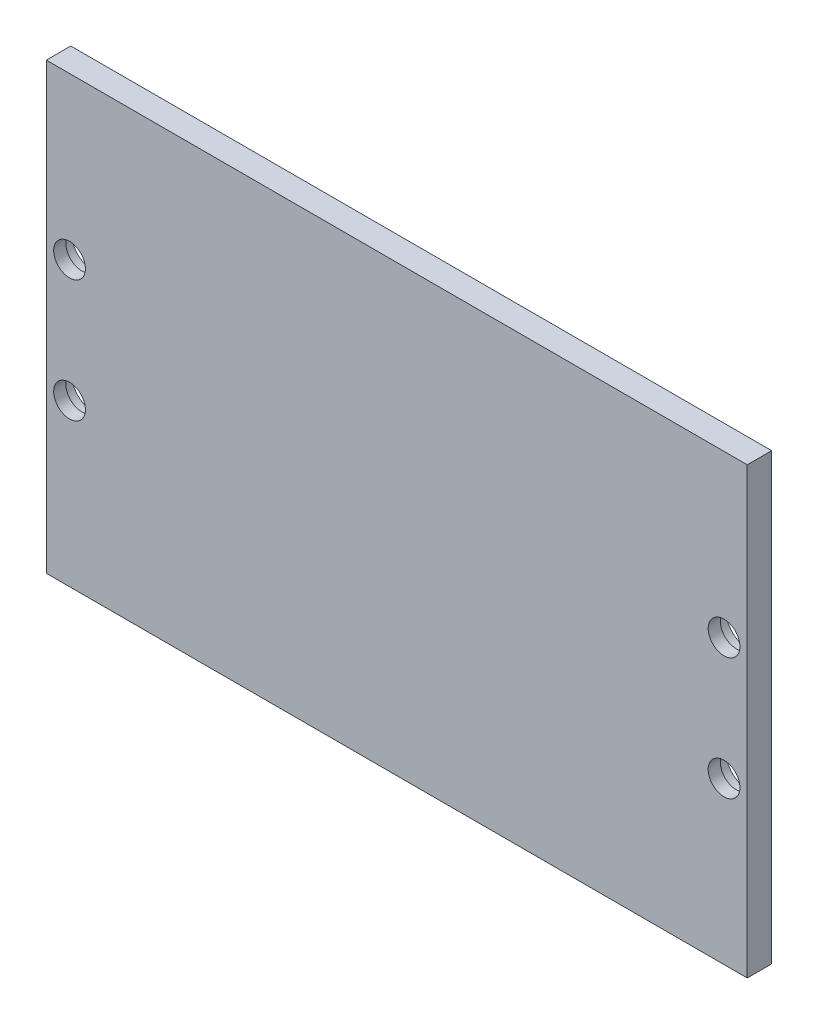
ISO-10303-21;
HEADER;
FILE_DESCRIPTION(('STEP AP214'),'2;1');
FILE_NAME('part.step','',(''),(''),'','','');
FILE_SCHEMA(('AUTOMOTIVE_DESIGN { 1 0 10303 214 1 1 1 1 }'));
ENDSEC;
DATA;
#1=APPLICATION_CONTEXT('core data for automotive mechanical design processes');
#2=APPLICATION_PROTOCOL_DEFINITION('international standard','automotive_design',2000,#1);
#3=PRODUCT_CONTEXT('',#1,'mechanical');
#4=PRODUCT('Part','Part','',(#3));
#5=PRODUCT_RELATED_PRODUCT_CATEGORY('part','',(#4));
#6=PRODUCT_DEFINITION_FORMATION('','',#4);
#7=PRODUCT_DEFINITION_CONTEXT('part definition',#1,'design');
#8=PRODUCT_DEFINITION('design','',#6,#7);
#9=PRODUCT_DEFINITION_SHAPE('','',#8);
#10=(LENGTH_UNIT() NAMED_UNIT(*) SI_UNIT(.MILLI.,.METRE.));
#11=(NAMED_UNIT(*) PLANE_ANGLE_UNIT() SI_UNIT($,.RADIAN.));
#12=(NAMED_UNIT(*) SI_UNIT($,.STERADIAN.) SOLID_ANGLE_UNIT());
#13=UNCERTAINTY_MEASURE_WITH_UNIT(LENGTH_MEASURE(1.E-05),#10,'distance_accuracy_value','');
#14=(GEOMETRIC_REPRESENTATION_CONTEXT(3) GLOBAL_UNCERTAINTY_ASSIGNED_CONTEXT((#13)) GLOBAL_UNIT_ASSIGNED_CONTEXT((#10,
#11,#12)) REPRESENTATION_CONTEXT('',''));
#15=CARTESIAN_POINT('',(0.,0.,0.));
#16=DIRECTION('',(0.,0.,1.));
#17=DIRECTION('',(1.,0.,0.));
#18=AXIS2_PLACEMENT_3D('',#15,#16,#17);
#19=CARTESIAN_POINT('',(25.5706075886704,34.3773615630913,0.));
#20=DIRECTION('',(0.,0.,1.));
#21=DIRECTION('',(1.,0.,0.));
#22=AXIS2_PLACEMENT_3D('',#19,#20,#21);
#23=CYLINDRICAL_SURFACE('',#22,0.925);
#24=CARTESIAN_POINT('',(25.5706075886704,34.3773615630913,0.));
#25=DIRECTION('',(0.,0.,1.));
#26=DIRECTION('',(1.,0.,0.));
#27=AXIS2_PLACEMENT_3D('',#24,#25,#26);
#28=CIRCLE('',#27,0.925);
#29=CARTESIAN_POINT('',(26.4956075886704,34.3773615630913,0.));
#30=VERTEX_POINT('',#29);
#31=EDGE_CURVE('E105',#30,#30,#28,.T.);
#32=ORIENTED_EDGE('',*,*,#31,.F.);
#33=EDGE_LOOP('',(#32));
#34=FACE_BOUND('',#33,.T.);
#35=CARTESIAN_POINT('',(25.5706075886704,34.3773615630913,0.500000000000003));
#36=DIRECTION('',(0.,0.,1.));
#37=DIRECTION('',(0.,-1.,0.));
#38=AXIS2_PLACEMENT_3D('',#35,#36,#37);
#39=CIRCLE('',#38,0.925);
#40=CARTESIAN_POINT('',(25.5706075886704,33.4523615630913,0.500000000000004));
#41=VERTEX_POINT('',#40);
#42=EDGE_CURVE('E11',#41,#41,#39,.F.);
#43=ORIENTED_EDGE('',*,*,#42,.F.);
#44=EDGE_LOOP('',(#43));
#45=FACE_BOUND('',#44,.T.);
#46=ADVANCED_FACE('F33',(#34,#45),#23,.F.);
#47=CARTESIAN_POINT('',(-1.22939241132963,29.3773615630913,0.));
#48=DIRECTION('',(0.,0.,1.));
#49=DIRECTION('',(1.,0.,0.));
#50=AXIS2_PLACEMENT_3D('',#47,#48,#49);
#51=CYLINDRICAL_SURFACE('',#50,0.924999999999999);
#52=CARTESIAN_POINT('',(-1.22939241132963,29.3773615630913,0.));
#53=DIRECTION('',(0.,0.,1.));
#54=DIRECTION('',(1.,0.,0.));
#55=AXIS2_PLACEMENT_3D('',#52,#53,#54);
#56=CIRCLE('',#55,0.924999999999999);
#57=CARTESIAN_POINT('',(-0.304392411329634,29.3773615630913,0.));
#58=VERTEX_POINT('',#57);
#59=EDGE_CURVE('E331',#58,#58,#56,.T.);
#60=ORIENTED_EDGE('',*,*,#59,.F.);
#61=EDGE_LOOP('',(#60));
#62=FACE_BOUND('',#61,.T.);
#63=CARTESIAN_POINT('',(-1.22939241132963,29.3773615630913,0.500000000000005));
#64=DIRECTION('',(0.,0.,1.));
#65=DIRECTION('',(0.,-1.,0.));
#66=AXIS2_PLACEMENT_3D('',#63,#64,#65);
#67=CIRCLE('',#66,0.924999999999999);
#68=CARTESIAN_POINT('',(-1.22939241132963,28.4523615630913,0.500000000000005));
#69=VERTEX_POINT('',#68);
#70=EDGE_CURVE('E42',#69,#69,#67,.F.);
#71=ORIENTED_EDGE('',*,*,#70,.F.);
#72=EDGE_LOOP('',(#71));
#73=FACE_BOUND('',#72,.T.);
#74=ADVANCED_FACE('F117',(#62,#73),#51,.F.);
#75=CARTESIAN_POINT('',(26.5206075886704,22.7773615630913,1.));
#76=DIRECTION('',(-1.,0.,0.));
#77=DIRECTION('',(0.,-1.,0.));
#78=AXIS2_PLACEMENT_3D('',#75,#76,#77);
#79=PLANE('',#78);
#80=DIRECTION('',(0.,1.,0.));
#81=VECTOR('',#80,1.);
#82=CARTESIAN_POINT('',(26.5206075886704,22.7773615630913,0.));
#83=LINE('',#82,#81);
#84=CARTESIAN_POINT('',(26.5206075886704,22.7773615630913,0.));
#85=VERTEX_POINT('',#84);
#86=CARTESIAN_POINT('',(26.5206075886704,40.9773615630913,0.));
#87=VERTEX_POINT('',#86);
#88=EDGE_CURVE('E102',#85,#87,#83,.T.);
#89=ORIENTED_EDGE('',*,*,#88,.T.);
#90=DIRECTION('',(0.,0.,-1.));
#91=VECTOR('',#90,1.);
#92=CARTESIAN_POINT('',(26.5206075886704,40.9773615630913,1.));
#93=LINE('',#92,#91);
#94=CARTESIAN_POINT('',(26.5206075886704,40.9773615630913,1.));
#95=VERTEX_POINT('',#94);
#96=EDGE_CURVE('E93',#95,#87,#93,.T.);
#97=ORIENTED_EDGE('',*,*,#96,.F.);
#98=DIRECTION('',(0.,1.,0.));
#99=VECTOR('',#98,1.);
#100=CARTESIAN_POINT('',(26.5206075886704,22.7773615630913,1.));
#101=LINE('',#100,#99);
#102=CARTESIAN_POINT('',(26.5206075886704,22.7773615630913,1.));
#103=VERTEX_POINT('',#102);
#104=EDGE_CURVE('E87',#103,#95,#101,.T.);
#105=ORIENTED_EDGE('',*,*,#104,.F.);
#106=DIRECTION('',(0.,0.,-1.));
#107=VECTOR('',#106,1.);
#108=CARTESIAN_POINT('',(26.5206075886704,22.7773615630913,1.));
#109=LINE('',#108,#107);
#110=EDGE_CURVE('E98',#103,#85,#109,.T.);
#111=ORIENTED_EDGE('',*,*,#110,.T.);
#112=EDGE_LOOP('',(#89,#97,#105,#111));
#113=FACE_BOUND('',#112,.T.);
#114=ADVANCED_FACE('F35',(#113),#79,.F.);
#115=CARTESIAN_POINT('',(26.5206075886704,40.9773615630913,1.));
#116=DIRECTION('',(0.,-1.,0.));
#117=DIRECTION('',(0.,0.,-1.));
#118=AXIS2_PLACEMENT_3D('',#115,#116,#117);
#119=PLANE('',#118);
#120=DIRECTION('',(-1.,0.,0.));
#121=VECTOR('',#120,1.);
#122=CARTESIAN_POINT('',(26.5206075886704,40.9773615630913,0.));
#123=LINE('',#122,#121);
#124=CARTESIAN_POINT('',(-2.17939241132963,40.9773615630913,0.));
#125=VERTEX_POINT('',#124);
#126=EDGE_CURVE('E92',#87,#125,#123,.T.);
#127=ORIENTED_EDGE('',*,*,#126,.T.);
#128=DIRECTION('',(0.,0.,-1.));
#129=VECTOR('',#128,1.);
#130=CARTESIAN_POINT('',(-2.17939241132963,40.9773615630913,1.));
#131=LINE('',#130,#129);
#132=CARTESIAN_POINT('',(-2.17939241132963,40.9773615630913,1.));
#133=VERTEX_POINT('',#132);
#134=EDGE_CURVE('E90',#133,#125,#131,.T.);
#135=ORIENTED_EDGE('',*,*,#134,.F.);
#136=DIRECTION('',(-1.,0.,0.));
#137=VECTOR('',#136,1.);
#138=CARTESIAN_POINT('',(26.5206075886704,40.9773615630913,1.));
#139=LINE('',#138,#137);
#140=EDGE_CURVE('E81',#95,#133,#139,.T.);
#141=ORIENTED_EDGE('',*,*,#140,.F.);
#142=ORIENTED_EDGE('',*,*,#96,.T.);
#143=EDGE_LOOP('',(#127,#135,#141,#142));
#144=FACE_BOUND('',#143,.T.);
#145=ADVANCED_FACE('F91',(#144),#119,.F.);
#146=CARTESIAN_POINT('',(-2.17939241132964,22.7773615630913,1.));
#147=DIRECTION('',(1.,0.,0.));
#148=DIRECTION('',(0.,1.,0.));
#149=AXIS2_PLACEMENT_3D('',#146,#147,#148);
#150=PLANE('',#149);
#151=DIRECTION('',(0.,-1.,0.));
#152=VECTOR('',#151,1.);
#153=CARTESIAN_POINT('',(-2.17939241132964,22.7773615630913,0.));
#154=LINE('',#153,#152);
#155=CARTESIAN_POINT('',(-2.17939241132964,22.7773615630913,0.));
#156=VERTEX_POINT('',#155);
#157=EDGE_CURVE('E67',#125,#156,#154,.T.);
#158=ORIENTED_EDGE('',*,*,#157,.T.);
#159=DIRECTION('',(0.,0.,-1.));
#160=VECTOR('',#159,1.);
#161=CARTESIAN_POINT('',(-2.17939241132964,22.7773615630913,1.));
#162=LINE('',#161,#160);
#163=CARTESIAN_POINT('',(-2.17939241132964,22.7773615630913,1.));
#164=VERTEX_POINT('',#163);
#165=EDGE_CURVE('E94',#164,#156,#162,.T.);
#166=ORIENTED_EDGE('',*,*,#165,.F.);
#167=DIRECTION('',(0.,-1.,0.));
#168=VECTOR('',#167,1.);
#169=CARTESIAN_POINT('',(-2.17939241132964,22.7773615630913,1.));
#170=LINE('',#169,#168);
#171=EDGE_CURVE('E85',#133,#164,#170,.T.);
#172=ORIENTED_EDGE('',*,*,#171,.F.);
#173=ORIENTED_EDGE('',*,*,#134,.T.);
#174=EDGE_LOOP('',(#158,#166,#172,#173));
#175=FACE_BOUND('',#174,.T.);
#176=ADVANCED_FACE('F96',(#175),#150,.F.);
#177=CARTESIAN_POINT('',(26.5206075886704,22.7773615630913,1.));
#178=DIRECTION('',(0.,1.,0.));
#179=DIRECTION('',(-1.,0.,0.));
#180=AXIS2_PLACEMENT_3D('',#177,#178,#179);
#181=PLANE('',#180);
#182=DIRECTION('',(1.,0.,0.));
#183=VECTOR('',#182,1.);
#184=CARTESIAN_POINT('',(26.5206075886704,22.7773615630913,0.));
#185=LINE('',#184,#183);
#186=EDGE_CURVE('E73',#156,#85,#185,.T.);
#187=ORIENTED_EDGE('',*,*,#186,.T.);
#188=ORIENTED_EDGE('',*,*,#110,.F.);
#189=DIRECTION('',(1.,0.,0.));
#190=VECTOR('',#189,1.);
#191=CARTESIAN_POINT('',(26.5206075886704,22.7773615630913,1.));
#192=LINE('',#191,#190);
#193=EDGE_CURVE('E50',#164,#103,#192,.T.);
#194=ORIENTED_EDGE('',*,*,#193,.F.);
#195=ORIENTED_EDGE('',*,*,#165,.T.);
#196=EDGE_LOOP('',(#187,#188,#194,#195));
#197=FACE_BOUND('',#196,.T.);
#198=ADVANCED_FACE('F145',(#197),#181,.F.);
#199=CARTESIAN_POINT('',(0.,0.,1.));
#200=DIRECTION('',(0.,0.,1.));
#201=DIRECTION('',(1.,0.,0.));
#202=AXIS2_PLACEMENT_3D('',#199,#200,#201);
#203=PLANE('',#202);
#204=ORIENTED_EDGE('',*,*,#104,.T.);
#205=ORIENTED_EDGE('',*,*,#140,.T.);
#206=ORIENTED_EDGE('',*,*,#171,.T.);
#207=ORIENTED_EDGE('',*,*,#193,.T.);
#208=EDGE_LOOP('',(#204,#205,#206,#207));
#209=FACE_BOUND('',#208,.T.);
#210=CARTESIAN_POINT('',(-1.22939241132963,34.3773615630913,1.));
#211=DIRECTION('',(0.,0.,-1.));
#212=DIRECTION('',(0.,1.,0.));
#213=AXIS2_PLACEMENT_3D('',#210,#211,#212);
#214=CIRCLE('',#213,0.649999999999999);
#215=CARTESIAN_POINT('',(-1.22939241132963,35.0273615630913,1.));
#216=VERTEX_POINT('',#215);
#217=EDGE_CURVE('E320',#216,#216,#214,.T.);
#218=ORIENTED_EDGE('',*,*,#217,.T.);
#219=EDGE_LOOP('',(#218));
#220=FACE_BOUND('',#219,.T.);
#221=CARTESIAN_POINT('',(-1.22939241132963,29.3773615630913,1.00000000000001));
#222=DIRECTION('',(0.,0.,-1.));
#223=DIRECTION('',(0.,-1.,0.));
#224=AXIS2_PLACEMENT_3D('',#221,#222,#223);
#225=CIRCLE('',#224,0.649999999999999);
#226=CARTESIAN_POINT('',(-1.22939241132963,28.7273615630913,1.00000000000001));
#227=VERTEX_POINT('',#226);
#228=EDGE_CURVE('E316',#227,#227,#225,.T.);
#229=ORIENTED_EDGE('',*,*,#228,.T.);
#230=EDGE_LOOP('',(#229));
#231=FACE_BOUND('',#230,.T.);
#232=CARTESIAN_POINT('',(25.5706075886704,29.3773615630913,1.00000000000001));
#233=DIRECTION('',(0.,0.,-1.));
#234=DIRECTION('',(0.,1.,0.));
#235=AXIS2_PLACEMENT_3D('',#232,#233,#234);
#236=CIRCLE('',#235,0.65);
#237=CARTESIAN_POINT('',(25.5706075886704,30.0273615630913,1.));
#238=VERTEX_POINT('',#237);
#239=EDGE_CURVE('E305',#238,#238,#236,.T.);
#240=ORIENTED_EDGE('',*,*,#239,.T.);
#241=EDGE_LOOP('',(#240));
#242=FACE_BOUND('',#241,.T.);
#243=CARTESIAN_POINT('',(25.5706075886704,34.3773615630913,1.));
#244=DIRECTION('',(0.,0.,-1.));
#245=DIRECTION('',(0.,-1.,0.));
#246=AXIS2_PLACEMENT_3D('',#243,#244,#245);
#247=CIRCLE('',#246,0.65);
#248=CARTESIAN_POINT('',(25.5706075886704,33.7273615630913,1.));
#249=VERTEX_POINT('',#248);
#250=EDGE_CURVE('E302',#249,#249,#247,.T.);
#251=ORIENTED_EDGE('',*,*,#250,.T.);
#252=EDGE_LOOP('',(#251));
#253=FACE_BOUND('',#252,.T.);
#254=ADVANCED_FACE('F82',(#209,#220,#231,#242,#253),#203,.T.);
#255=CARTESIAN_POINT('',(0.,0.,0.));
#256=DIRECTION('',(0.,0.,1.));
#257=DIRECTION('',(1.,0.,0.));
#258=AXIS2_PLACEMENT_3D('',#255,#256,#257);
#259=PLANE('',#258);
#260=CARTESIAN_POINT('',(25.5706075886704,29.3773615630913,0.));
#261=DIRECTION('',(0.,0.,1.));
#262=DIRECTION('',(1.,0.,0.));
#263=AXIS2_PLACEMENT_3D('',#260,#261,#262);
#264=CIRCLE('',#263,0.924999999999998);
#265=CARTESIAN_POINT('',(26.4956075886704,29.3773615630913,0.));
#266=VERTEX_POINT('',#265);
#267=EDGE_CURVE('E335',#266,#266,#264,.T.);
#268=ORIENTED_EDGE('',*,*,#267,.T.);
#269=EDGE_LOOP('',(#268));
#270=FACE_BOUND('',#269,.T.);
#271=CARTESIAN_POINT('',(-1.22939241132963,34.3773615630913,0.));
#272=DIRECTION('',(0.,0.,1.));
#273=DIRECTION('',(1.,0.,0.));
#274=AXIS2_PLACEMENT_3D('',#271,#272,#273);
#275=CIRCLE('',#274,0.925000000000001);
#276=CARTESIAN_POINT('',(-0.304392411329632,34.3773615630913,0.));
#277=VERTEX_POINT('',#276);
#278=EDGE_CURVE('E334',#277,#277,#275,.T.);
#279=ORIENTED_EDGE('',*,*,#278,.T.);
#280=EDGE_LOOP('',(#279));
#281=FACE_BOUND('',#280,.T.);
#282=ORIENTED_EDGE('',*,*,#59,.T.);
#283=EDGE_LOOP('',(#282));
#284=FACE_BOUND('',#283,.T.);
#285=ORIENTED_EDGE('',*,*,#31,.T.);
#286=EDGE_LOOP('',(#285));
#287=FACE_BOUND('',#286,.T.);
#288=ORIENTED_EDGE('',*,*,#88,.F.);
#289=ORIENTED_EDGE('',*,*,#186,.F.);
#290=ORIENTED_EDGE('',*,*,#157,.F.);
#291=ORIENTED_EDGE('',*,*,#126,.F.);
#292=EDGE_LOOP('',(#288,#289,#290,#291));
#293=FACE_BOUND('',#292,.T.);
#294=ADVANCED_FACE('F140',(#270,#281,#284,#287,#293),#259,.F.);
#295=CARTESIAN_POINT('',(-1.22939241132963,34.3773615630913,0.));
#296=DIRECTION('',(0.,0.,1.));
#297=DIRECTION('',(1.,0.,0.));
#298=AXIS2_PLACEMENT_3D('',#295,#296,#297);
#299=CYLINDRICAL_SURFACE('',#298,0.925000000000001);
#300=CARTESIAN_POINT('',(-1.22939241132963,34.3773615630913,0.500000000000003));
#301=DIRECTION('',(0.,0.,-1.));
#302=DIRECTION('',(0.,1.,0.));
#303=AXIS2_PLACEMENT_3D('',#300,#301,#302);
#304=CIRCLE('',#303,0.925000000000005);
#305=CARTESIAN_POINT('',(-1.22939241132963,35.3023615630913,0.500000000000003));
#306=VERTEX_POINT('',#305);
#307=EDGE_CURVE('E326',#306,#306,#304,.T.);
#308=ORIENTED_EDGE('',*,*,#307,.F.);
#309=EDGE_LOOP('',(#308));
#310=FACE_BOUND('',#309,.T.);
#311=ORIENTED_EDGE('',*,*,#278,.F.);
#312=EDGE_LOOP('',(#311));
#313=FACE_BOUND('',#312,.T.);
#314=ADVANCED_FACE('F137',(#310,#313),#299,.F.);
#315=CARTESIAN_POINT('',(25.5706075886704,29.3773615630913,0.));
#316=DIRECTION('',(0.,0.,1.));
#317=DIRECTION('',(1.,0.,0.));
#318=AXIS2_PLACEMENT_3D('',#315,#316,#317);
#319=CYLINDRICAL_SURFACE('',#318,0.924999999999998);
#320=CARTESIAN_POINT('',(25.5706075886704,29.3773615630913,0.500000000000005));
#321=DIRECTION('',(0.,0.,-1.));
#322=DIRECTION('',(0.,1.,0.));
#323=AXIS2_PLACEMENT_3D('',#320,#321,#322);
#324=CIRCLE('',#323,0.925000000000006);
#325=CARTESIAN_POINT('',(25.5706075886704,30.3023615630913,0.500000000000005));
#326=VERTEX_POINT('',#325);
#327=EDGE_CURVE('E311',#326,#326,#324,.T.);
#328=ORIENTED_EDGE('',*,*,#327,.F.);
#329=EDGE_LOOP('',(#328));
#330=FACE_BOUND('',#329,.T.);
#331=ORIENTED_EDGE('',*,*,#267,.F.);
#332=EDGE_LOOP('',(#331));
#333=FACE_BOUND('',#332,.T.);
#334=ADVANCED_FACE('F134',(#330,#333),#319,.F.);
#335=CARTESIAN_POINT('',(-1.22939241132963,34.3773615630913,0.500000000000003));
#336=DIRECTION('',(0.,0.,-1.));
#337=DIRECTION('',(0.,1.,0.));
#338=AXIS2_PLACEMENT_3D('',#335,#336,#337);
#339=PLANE('',#338);
#340=ORIENTED_EDGE('',*,*,#307,.T.);
#341=EDGE_LOOP('',(#340));
#342=FACE_BOUND('',#341,.T.);
#343=CARTESIAN_POINT('',(-1.22939241132963,34.3773615630913,0.500000000000003));
#344=DIRECTION('',(0.,0.,-1.));
#345=DIRECTION('',(0.,1.,0.));
#346=AXIS2_PLACEMENT_3D('',#343,#344,#345);
#347=CIRCLE('',#346,0.649999999999999);
#348=CARTESIAN_POINT('',(-1.22939241132963,35.0273615630913,0.500000000000003));
#349=VERTEX_POINT('',#348);
#350=EDGE_CURVE('E323',#349,#349,#347,.T.);
#351=ORIENTED_EDGE('',*,*,#350,.F.);
#352=EDGE_LOOP('',(#351));
#353=FACE_BOUND('',#352,.T.);
#354=ADVANCED_FACE('F132',(#342,#353),#339,.T.);
#355=CARTESIAN_POINT('',(-1.22939241132963,34.3773615630913,0.500000000000003));
#356=DIRECTION('',(0.,0.,1.));
#357=DIRECTION('',(0.,-1.,0.));
#358=AXIS2_PLACEMENT_3D('',#355,#356,#357);
#359=CYLINDRICAL_SURFACE('',#358,0.649999999999999);
#360=ORIENTED_EDGE('',*,*,#350,.T.);
#361=EDGE_LOOP('',(#360));
#362=FACE_BOUND('',#361,.T.);
#363=ORIENTED_EDGE('',*,*,#217,.F.);
#364=EDGE_LOOP('',(#363));
#365=FACE_BOUND('',#364,.T.);
#366=ADVANCED_FACE('F200',(#362,#365),#359,.F.);
#367=CARTESIAN_POINT('',(-1.22939241132963,29.3773615630913,0.500000000000005));
#368=DIRECTION('',(0.,0.,1.));
#369=DIRECTION('',(0.,-1.,0.));
#370=AXIS2_PLACEMENT_3D('',#367,#368,#369);
#371=PLANE('',#370);
#372=ORIENTED_EDGE('',*,*,#70,.T.);
#373=EDGE_LOOP('',(#372));
#374=FACE_BOUND('',#373,.T.);
#375=CARTESIAN_POINT('',(-1.22939241132963,29.3773615630913,0.500000000000005));
#376=DIRECTION('',(0.,0.,-1.));
#377=DIRECTION('',(0.,-1.,0.));
#378=AXIS2_PLACEMENT_3D('',#375,#376,#377);
#379=CIRCLE('',#378,0.649999999999999);
#380=CARTESIAN_POINT('',(-1.22939241132963,28.7273615630913,0.500000000000005));
#381=VERTEX_POINT('',#380);
#382=EDGE_CURVE('E317',#381,#381,#379,.T.);
#383=ORIENTED_EDGE('',*,*,#382,.F.);
#384=EDGE_LOOP('',(#383));
#385=FACE_BOUND('',#384,.T.);
#386=ADVANCED_FACE('F114',(#374,#385),#371,.F.);
#387=CARTESIAN_POINT('',(-1.22939241132963,29.3773615630913,0.500000000000005));
#388=DIRECTION('',(0.,0.,1.));
#389=DIRECTION('',(0.,-1.,0.));
#390=AXIS2_PLACEMENT_3D('',#387,#388,#389);
#391=CYLINDRICAL_SURFACE('',#390,0.649999999999999);
#392=ORIENTED_EDGE('',*,*,#382,.T.);
#393=EDGE_LOOP('',(#392));
#394=FACE_BOUND('',#393,.T.);
#395=ORIENTED_EDGE('',*,*,#228,.F.);
#396=EDGE_LOOP('',(#395));
#397=FACE_BOUND('',#396,.T.);
#398=ADVANCED_FACE('F213',(#394,#397),#391,.F.);
#399=CARTESIAN_POINT('',(25.5706075886704,29.3773615630913,0.500000000000005));
#400=DIRECTION('',(0.,0.,-1.));
#401=DIRECTION('',(0.,1.,0.));
#402=AXIS2_PLACEMENT_3D('',#399,#400,#401);
#403=PLANE('',#402);
#404=ORIENTED_EDGE('',*,*,#327,.T.);
#405=EDGE_LOOP('',(#404));
#406=FACE_BOUND('',#405,.T.);
#407=CARTESIAN_POINT('',(25.5706075886704,29.3773615630913,0.500000000000005));
#408=DIRECTION('',(0.,0.,-1.));
#409=DIRECTION('',(0.,1.,0.));
#410=AXIS2_PLACEMENT_3D('',#407,#408,#409);
#411=CIRCLE('',#410,0.65);
#412=CARTESIAN_POINT('',(25.5706075886704,30.0273615630913,0.500000000000005));
#413=VERTEX_POINT('',#412);
#414=EDGE_CURVE('E308',#413,#413,#411,.T.);
#415=ORIENTED_EDGE('',*,*,#414,.F.);
#416=EDGE_LOOP('',(#415));
#417=FACE_BOUND('',#416,.T.);
#418=ADVANCED_FACE('F220',(#406,#417),#403,.T.);
#419=CARTESIAN_POINT('',(25.5706075886704,29.3773615630913,0.500000000000005));
#420=DIRECTION('',(0.,0.,1.));
#421=DIRECTION('',(0.,-1.,0.));
#422=AXIS2_PLACEMENT_3D('',#419,#420,#421);
#423=CYLINDRICAL_SURFACE('',#422,0.65);
#424=ORIENTED_EDGE('',*,*,#414,.T.);
#425=EDGE_LOOP('',(#424));
#426=FACE_BOUND('',#425,.T.);
#427=ORIENTED_EDGE('',*,*,#239,.F.);
#428=EDGE_LOOP('',(#427));
#429=FACE_BOUND('',#428,.T.);
#430=ADVANCED_FACE('F228',(#426,#429),#423,.F.);
#431=CARTESIAN_POINT('',(25.5706075886704,34.3773615630913,0.500000000000003));
#432=DIRECTION('',(0.,0.,1.));
#433=DIRECTION('',(0.,-1.,0.));
#434=AXIS2_PLACEMENT_3D('',#431,#432,#433);
#435=PLANE('',#434);
#436=ORIENTED_EDGE('',*,*,#42,.T.);
#437=EDGE_LOOP('',(#436));
#438=FACE_BOUND('',#437,.T.);
#439=CARTESIAN_POINT('',(25.5706075886704,34.3773615630913,0.500000000000003));
#440=DIRECTION('',(0.,0.,-1.));
#441=DIRECTION('',(0.,-1.,0.));
#442=AXIS2_PLACEMENT_3D('',#439,#440,#441);
#443=CIRCLE('',#442,0.65);
#444=CARTESIAN_POINT('',(25.5706075886704,33.7273615630913,0.500000000000003));
#445=VERTEX_POINT('',#444);
#446=EDGE_CURVE('E299',#445,#445,#443,.T.);
#447=ORIENTED_EDGE('',*,*,#446,.F.);
#448=EDGE_LOOP('',(#447));
#449=FACE_BOUND('',#448,.T.);
#450=ADVANCED_FACE('F236',(#438,#449),#435,.F.);
#451=CARTESIAN_POINT('',(25.5706075886704,34.3773615630913,0.500000000000003));
#452=DIRECTION('',(0.,0.,1.));
#453=DIRECTION('',(0.,-1.,0.));
#454=AXIS2_PLACEMENT_3D('',#451,#452,#453);
#455=CYLINDRICAL_SURFACE('',#454,0.65);
#456=ORIENTED_EDGE('',*,*,#446,.T.);
#457=EDGE_LOOP('',(#456));
#458=FACE_BOUND('',#457,.T.);
#459=ORIENTED_EDGE('',*,*,#250,.F.);
#460=EDGE_LOOP('',(#459));
#461=FACE_BOUND('',#460,.T.);
#462=ADVANCED_FACE('F244',(#458,#461),#455,.F.);
#463=CLOSED_SHELL('',(#46,#74,#114,#145,#176,#198,#254,#294,#314,#334,#354,#366,#386,#398,#418,
#430,#450,#462));
#464=MANIFOLD_SOLID_BREP('B2',#463);
#465=ADVANCED_BREP_SHAPE_REPRESENTATION('',(#18,#464),#14);
#466=SHAPE_DEFINITION_REPRESENTATION(#9,#465);
ENDSEC;
END-ISO-10303-21;
